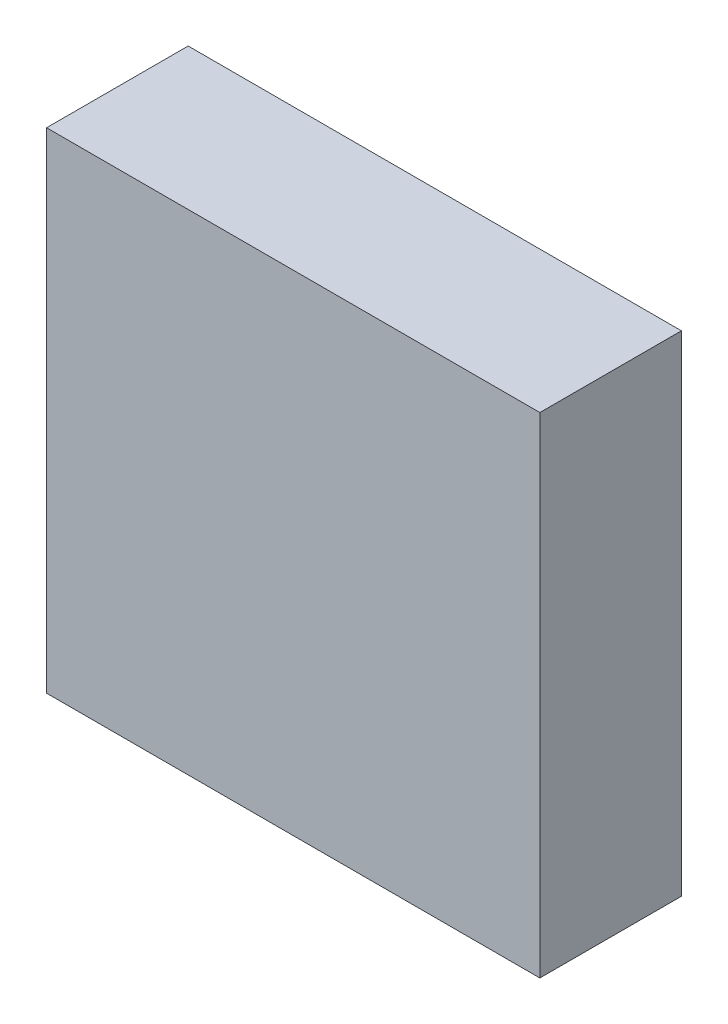
ISO-10303-21;
HEADER;
FILE_DESCRIPTION(('STEP AP214'),'2;1');
FILE_NAME('part.step','',(''),(''),'','','');
FILE_SCHEMA(('AUTOMOTIVE_DESIGN { 1 0 10303 214 1 1 1 1 }'));
ENDSEC;
DATA;
#1=APPLICATION_CONTEXT('core data for automotive mechanical design processes');
#2=APPLICATION_PROTOCOL_DEFINITION('international standard','automotive_design',2000,#1);
#3=PRODUCT_CONTEXT('',#1,'mechanical');
#4=PRODUCT('Part','Part','',(#3));
#5=PRODUCT_RELATED_PRODUCT_CATEGORY('part','',(#4));
#6=PRODUCT_DEFINITION_FORMATION('','',#4);
#7=PRODUCT_DEFINITION_CONTEXT('part definition',#1,'design');
#8=PRODUCT_DEFINITION('design','',#6,#7);
#9=PRODUCT_DEFINITION_SHAPE('','',#8);
#10=(LENGTH_UNIT() NAMED_UNIT(*) SI_UNIT(.MILLI.,.METRE.));
#11=(NAMED_UNIT(*) PLANE_ANGLE_UNIT() SI_UNIT($,.RADIAN.));
#12=(NAMED_UNIT(*) SI_UNIT($,.STERADIAN.) SOLID_ANGLE_UNIT());
#13=UNCERTAINTY_MEASURE_WITH_UNIT(LENGTH_MEASURE(1.E-05),#10,'distance_accuracy_value','');
#14=(GEOMETRIC_REPRESENTATION_CONTEXT(3) GLOBAL_UNCERTAINTY_ASSIGNED_CONTEXT((#13)) GLOBAL_UNIT_ASSIGNED_CONTEXT((#10,
#11,#12)) REPRESENTATION_CONTEXT('',''));
#15=CARTESIAN_POINT('',(0.,0.,0.));
#16=DIRECTION('',(0.,0.,1.));
#17=DIRECTION('',(1.,0.,0.));
#18=AXIS2_PLACEMENT_3D('',#15,#16,#17);
#19=CARTESIAN_POINT('',(28.039246549675,-14.8612751644933,8.883));
#20=DIRECTION('',(1.,0.,0.));
#21=DIRECTION('',(0.,0.,-1.));
#22=AXIS2_PLACEMENT_3D('',#19,#20,#21);
#23=PLANE('',#22);
#24=DIRECTION('',(0.,-1.,0.));
#25=VECTOR('',#24,1.);
#26=CARTESIAN_POINT('',(28.039246549675,-14.8612751644933,5.703));
#27=LINE('',#26,#25);
#28=CARTESIAN_POINT('',(28.039246549675,-14.8612751644933,5.703));
#29=VERTEX_POINT('',#28);
#30=CARTESIAN_POINT('',(28.039246549675,-25.8612751644933,5.703));
#31=VERTEX_POINT('',#30);
#32=EDGE_CURVE('E98',#29,#31,#27,.T.);
#33=ORIENTED_EDGE('',*,*,#32,.F.);
#34=DIRECTION('',(0.,0.,-1.));
#35=VECTOR('',#34,1.);
#36=CARTESIAN_POINT('',(28.039246549675,-14.8612751644933,8.883));
#37=LINE('',#36,#35);
#38=CARTESIAN_POINT('',(28.039246549675,-14.8612751644933,8.883));
#39=VERTEX_POINT('',#38);
#40=EDGE_CURVE('E11',#39,#29,#37,.T.);
#41=ORIENTED_EDGE('',*,*,#40,.F.);
#42=DIRECTION('',(0.,-1.,0.));
#43=VECTOR('',#42,1.);
#44=CARTESIAN_POINT('',(28.039246549675,-14.8612751644933,8.883));
#45=LINE('',#44,#43);
#46=CARTESIAN_POINT('',(28.039246549675,-25.8612751644933,8.883));
#47=VERTEX_POINT('',#46);
#48=EDGE_CURVE('E93',#39,#47,#45,.T.);
#49=ORIENTED_EDGE('',*,*,#48,.T.);
#50=DIRECTION('',(0.,0.,-1.));
#51=VECTOR('',#50,1.);
#52=CARTESIAN_POINT('',(28.039246549675,-25.8612751644933,8.883));
#53=LINE('',#52,#51);
#54=EDGE_CURVE('E36',#47,#31,#53,.T.);
#55=ORIENTED_EDGE('',*,*,#54,.T.);
#56=EDGE_LOOP('',(#33,#41,#49,#55));
#57=FACE_BOUND('',#56,.T.);
#58=ADVANCED_FACE('F33',(#57),#23,.T.);
#59=CARTESIAN_POINT('',(28.039246549675,-14.8612751644933,8.883));
#60=DIRECTION('',(0.,-1.,0.));
#61=DIRECTION('',(1.,0.,0.));
#62=AXIS2_PLACEMENT_3D('',#59,#60,#61);
#63=PLANE('',#62);
#64=DIRECTION('',(-1.,0.,0.));
#65=VECTOR('',#64,1.);
#66=CARTESIAN_POINT('',(28.039246549675,-14.8612751644933,5.703));
#67=LINE('',#66,#65);
#68=CARTESIAN_POINT('',(16.959246549675,-14.8612751644933,5.703));
#69=VERTEX_POINT('',#68);
#70=EDGE_CURVE('E66',#29,#69,#67,.T.);
#71=ORIENTED_EDGE('',*,*,#70,.T.);
#72=DIRECTION('',(0.,0.,-1.));
#73=VECTOR('',#72,1.);
#74=CARTESIAN_POINT('',(16.959246549675,-14.8612751644933,8.883));
#75=LINE('',#74,#73);
#76=CARTESIAN_POINT('',(16.959246549675,-14.8612751644933,8.883));
#77=VERTEX_POINT('',#76);
#78=EDGE_CURVE('E42',#77,#69,#75,.T.);
#79=ORIENTED_EDGE('',*,*,#78,.F.);
#80=DIRECTION('',(-1.,0.,0.));
#81=VECTOR('',#80,1.);
#82=CARTESIAN_POINT('',(28.039246549675,-14.8612751644933,8.883));
#83=LINE('',#82,#81);
#84=EDGE_CURVE('E83',#39,#77,#83,.T.);
#85=ORIENTED_EDGE('',*,*,#84,.F.);
#86=ORIENTED_EDGE('',*,*,#40,.T.);
#87=EDGE_LOOP('',(#71,#79,#85,#86));
#88=FACE_BOUND('',#87,.T.);
#89=ADVANCED_FACE('F108',(#88),#63,.F.);
#90=CARTESIAN_POINT('',(16.959246549675,-14.8612751644933,8.883));
#91=DIRECTION('',(1.,0.,0.));
#92=DIRECTION('',(0.,0.,-1.));
#93=AXIS2_PLACEMENT_3D('',#90,#91,#92);
#94=PLANE('',#93);
#95=DIRECTION('',(0.,-1.,0.));
#96=VECTOR('',#95,1.);
#97=CARTESIAN_POINT('',(16.959246549675,-14.8612751644933,5.703));
#98=LINE('',#97,#96);
#99=CARTESIAN_POINT('',(16.959246549675,-25.8612751644933,5.703));
#100=VERTEX_POINT('',#99);
#101=EDGE_CURVE('E90',#69,#100,#98,.T.);
#102=ORIENTED_EDGE('',*,*,#101,.T.);
#103=DIRECTION('',(0.,0.,-1.));
#104=VECTOR('',#103,1.);
#105=CARTESIAN_POINT('',(16.959246549675,-25.8612751644933,8.883));
#106=LINE('',#105,#104);
#107=CARTESIAN_POINT('',(16.959246549675,-25.8612751644933,8.883));
#108=VERTEX_POINT('',#107);
#109=EDGE_CURVE('E87',#108,#100,#106,.T.);
#110=ORIENTED_EDGE('',*,*,#109,.F.);
#111=DIRECTION('',(0.,-1.,0.));
#112=VECTOR('',#111,1.);
#113=CARTESIAN_POINT('',(16.959246549675,-14.8612751644933,8.883));
#114=LINE('',#113,#112);
#115=EDGE_CURVE('E78',#77,#108,#114,.T.);
#116=ORIENTED_EDGE('',*,*,#115,.F.);
#117=ORIENTED_EDGE('',*,*,#78,.T.);
#118=EDGE_LOOP('',(#102,#110,#116,#117));
#119=FACE_BOUND('',#118,.T.);
#120=ADVANCED_FACE('F88',(#119),#94,.F.);
#121=CARTESIAN_POINT('',(28.039246549675,-25.8612751644933,8.883));
#122=DIRECTION('',(0.,-1.,0.));
#123=DIRECTION('',(0.,0.,-1.));
#124=AXIS2_PLACEMENT_3D('',#121,#122,#123);
#125=PLANE('',#124);
#126=DIRECTION('',(-1.,0.,0.));
#127=VECTOR('',#126,1.);
#128=CARTESIAN_POINT('',(28.039246549675,-25.8612751644933,5.703));
#129=LINE('',#128,#127);
#130=EDGE_CURVE('E101',#31,#100,#129,.T.);
#131=ORIENTED_EDGE('',*,*,#130,.F.);
#132=ORIENTED_EDGE('',*,*,#54,.F.);
#133=DIRECTION('',(-1.,0.,0.));
#134=VECTOR('',#133,1.);
#135=CARTESIAN_POINT('',(28.039246549675,-25.8612751644933,8.883));
#136=LINE('',#135,#134);
#137=EDGE_CURVE('E82',#47,#108,#136,.T.);
#138=ORIENTED_EDGE('',*,*,#137,.T.);
#139=ORIENTED_EDGE('',*,*,#109,.T.);
#140=EDGE_LOOP('',(#131,#132,#138,#139));
#141=FACE_BOUND('',#140,.T.);
#142=ADVANCED_FACE('F92',(#141),#125,.T.);
#143=CARTESIAN_POINT('',(0.,0.,8.883));
#144=DIRECTION('',(0.,0.,-1.));
#145=DIRECTION('',(-1.,0.,0.));
#146=AXIS2_PLACEMENT_3D('',#143,#144,#145);
#147=PLANE('',#146);
#148=ORIENTED_EDGE('',*,*,#48,.F.);
#149=ORIENTED_EDGE('',*,*,#84,.T.);
#150=ORIENTED_EDGE('',*,*,#115,.T.);
#151=ORIENTED_EDGE('',*,*,#137,.F.);
#152=EDGE_LOOP('',(#148,#149,#150,#151));
#153=FACE_BOUND('',#152,.T.);
#154=ADVANCED_FACE('F81',(#153),#147,.F.);
#155=CARTESIAN_POINT('',(0.,0.,5.703));
#156=DIRECTION('',(0.,0.,-1.));
#157=DIRECTION('',(-1.,0.,0.));
#158=AXIS2_PLACEMENT_3D('',#155,#156,#157);
#159=PLANE('',#158);
#160=ORIENTED_EDGE('',*,*,#32,.T.);
#161=ORIENTED_EDGE('',*,*,#130,.T.);
#162=ORIENTED_EDGE('',*,*,#101,.F.);
#163=ORIENTED_EDGE('',*,*,#70,.F.);
#164=EDGE_LOOP('',(#160,#161,#162,#163));
#165=FACE_BOUND('',#164,.T.);
#166=ADVANCED_FACE('F106',(#165),#159,.T.);
#167=CLOSED_SHELL('',(#58,#89,#120,#142,#154,#166));
#168=MANIFOLD_SOLID_BREP('B2',#167);
#169=ADVANCED_BREP_SHAPE_REPRESENTATION('',(#18,#168),#14);
#170=SHAPE_DEFINITION_REPRESENTATION(#9,#169);
ENDSEC;
END-ISO-10303-21;
